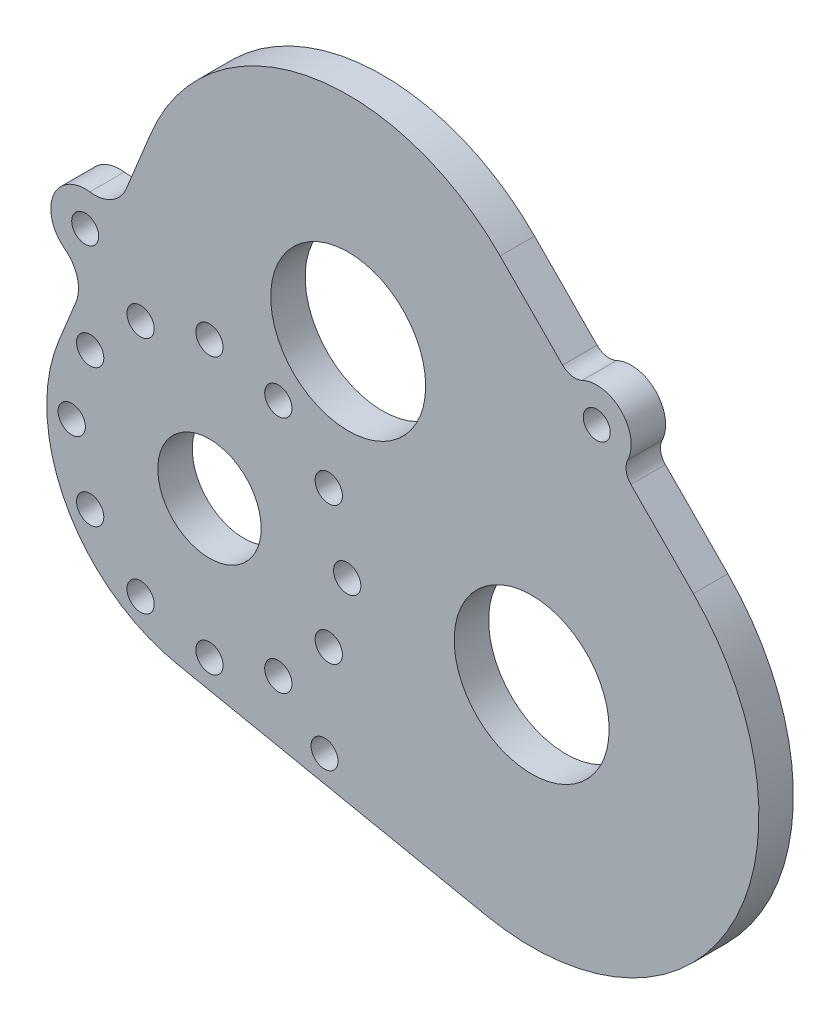
ISO-10303-21;
HEADER;
FILE_DESCRIPTION(('STEP AP214'),'2;1');
FILE_NAME('part.step','',(''),(''),'','','');
FILE_SCHEMA(('AUTOMOTIVE_DESIGN { 1 0 10303 214 1 1 1 1 }'));
ENDSEC;
DATA;
#1=APPLICATION_CONTEXT('core data for automotive mechanical design processes');
#2=APPLICATION_PROTOCOL_DEFINITION('international standard','automotive_design',2000,#1);
#3=PRODUCT_CONTEXT('',#1,'mechanical');
#4=PRODUCT('Part','Part','',(#3));
#5=PRODUCT_RELATED_PRODUCT_CATEGORY('part','',(#4));
#6=PRODUCT_DEFINITION_FORMATION('','',#4);
#7=PRODUCT_DEFINITION_CONTEXT('part definition',#1,'design');
#8=PRODUCT_DEFINITION('design','',#6,#7);
#9=PRODUCT_DEFINITION_SHAPE('','',#8);
#10=(LENGTH_UNIT() NAMED_UNIT(*) SI_UNIT(.MILLI.,.METRE.));
#11=(NAMED_UNIT(*) PLANE_ANGLE_UNIT() SI_UNIT($,.RADIAN.));
#12=(NAMED_UNIT(*) SI_UNIT($,.STERADIAN.) SOLID_ANGLE_UNIT());
#13=UNCERTAINTY_MEASURE_WITH_UNIT(LENGTH_MEASURE(1.E-05),#10,'distance_accuracy_value','');
#14=(GEOMETRIC_REPRESENTATION_CONTEXT(3) GLOBAL_UNCERTAINTY_ASSIGNED_CONTEXT((#13)) GLOBAL_UNIT_ASSIGNED_CONTEXT((#10,
#11,#12)) REPRESENTATION_CONTEXT('',''));
#15=CARTESIAN_POINT('',(0.,0.,0.));
#16=DIRECTION('',(0.,0.,1.));
#17=DIRECTION('',(1.,0.,0.));
#18=AXIS2_PLACEMENT_3D('',#15,#16,#17);
#19=CARTESIAN_POINT('',(-103.933485855139,112.712500000049,6.35));
#20=DIRECTION('',(0.,0.,1.));
#21=DIRECTION('',(1.,0.,0.));
#22=AXIS2_PLACEMENT_3D('',#19,#20,#21);
#23=PLANE('',#22);
#24=CARTESIAN_POINT('',(-116.633485855139,134.709545256174,6.35));
#25=DIRECTION('',(0.,0.,1.));
#26=DIRECTION('',(1.,0.,0.));
#27=AXIS2_PLACEMENT_3D('',#24,#25,#26);
#28=CIRCLE('',#27,2.51459999999995);
#29=CARTESIAN_POINT('',(-114.118885855139,134.709545256174,6.35));
#30=VERTEX_POINT('',#29);
#31=EDGE_CURVE('E377',#30,#30,#28,.T.);
#32=ORIENTED_EDGE('',*,*,#31,.F.);
#33=EDGE_LOOP('',(#32));
#34=FACE_BOUND('',#33,.T.);
#35=CARTESIAN_POINT('',(-91.2334858551395,134.709545256174,6.35));
#36=DIRECTION('',(0.,0.,1.));
#37=DIRECTION('',(1.,0.,0.));
#38=AXIS2_PLACEMENT_3D('',#35,#36,#37);
#39=CIRCLE('',#38,2.5146);
#40=CARTESIAN_POINT('',(-88.7188858551395,134.709545256174,6.35));
#41=VERTEX_POINT('',#40);
#42=EDGE_CURVE('E389',#41,#41,#39,.T.);
#43=ORIENTED_EDGE('',*,*,#42,.F.);
#44=EDGE_LOOP('',(#43));
#45=FACE_BOUND('',#44,.T.);
#46=CARTESIAN_POINT('',(-81.9364405990149,100.012500000049,6.35));
#47=DIRECTION('',(0.,0.,1.));
#48=DIRECTION('',(1.,0.,0.));
#49=AXIS2_PLACEMENT_3D('',#46,#47,#48);
#50=CIRCLE('',#49,2.51459999999999);
#51=CARTESIAN_POINT('',(-79.4218405990149,100.012500000049,6.35));
#52=VERTEX_POINT('',#51);
#53=EDGE_CURVE('E401',#52,#52,#50,.T.);
#54=ORIENTED_EDGE('',*,*,#53,.F.);
#55=EDGE_LOOP('',(#54));
#56=FACE_BOUND('',#55,.T.);
#57=CARTESIAN_POINT('',(-116.63348585514,90.7154547439244,6.35));
#58=DIRECTION('',(0.,0.,1.));
#59=DIRECTION('',(1.,0.,0.));
#60=AXIS2_PLACEMENT_3D('',#57,#58,#59);
#61=CIRCLE('',#60,2.51460000000001);
#62=CARTESIAN_POINT('',(-114.11888585514,90.7154547439244,6.35));
#63=VERTEX_POINT('',#62);
#64=EDGE_CURVE('E413',#63,#63,#61,.T.);
#65=ORIENTED_EDGE('',*,*,#64,.F.);
#66=EDGE_LOOP('',(#65));
#67=FACE_BOUND('',#66,.T.);
#68=CARTESIAN_POINT('',(-129.333485855139,112.712500000049,6.35));
#69=DIRECTION('',(0.,0.,1.));
#70=DIRECTION('',(1.,0.,0.));
#71=AXIS2_PLACEMENT_3D('',#68,#69,#70);
#72=CIRCLE('',#71,2.51460000000001);
#73=CARTESIAN_POINT('',(-126.818885855139,112.712500000049,6.35));
#74=VERTEX_POINT('',#73);
#75=EDGE_CURVE('E425',#74,#74,#72,.T.);
#76=ORIENTED_EDGE('',*,*,#75,.F.);
#77=EDGE_LOOP('',(#76));
#78=FACE_BOUND('',#77,.T.);
#79=CARTESIAN_POINT('',(-78.5334858551395,112.712500000049,6.35));
#80=DIRECTION('',(0.,0.,1.));
#81=DIRECTION('',(1.,0.,0.));
#82=AXIS2_PLACEMENT_3D('',#79,#80,#81);
#83=CIRCLE('',#82,2.51460000000001);
#84=CARTESIAN_POINT('',(-76.0188858551395,112.712500000049,6.35));
#85=VERTEX_POINT('',#84);
#86=EDGE_CURVE('E437',#85,#85,#83,.T.);
#87=ORIENTED_EDGE('',*,*,#86,.F.);
#88=EDGE_LOOP('',(#87));
#89=FACE_BOUND('',#88,.T.);
#90=CARTESIAN_POINT('',(-32.5089058218242,160.208997143062,6.35));
#91=DIRECTION('',(0.,0.,1.));
#92=DIRECTION('',(1.,0.,0.));
#93=AXIS2_PLACEMENT_3D('',#90,#91,#92);
#94=CIRCLE('',#93,2.48920000000002);
#95=CARTESIAN_POINT('',(-30.0197058218242,160.208997143062,6.35));
#96=VERTEX_POINT('',#95);
#97=EDGE_CURVE('E449',#96,#96,#94,.T.);
#98=ORIENTED_EDGE('',*,*,#97,.F.);
#99=EDGE_LOOP('',(#98));
#100=FACE_BOUND('',#99,.T.);
#101=CARTESIAN_POINT('',(-126.845846883905,144.36719939503,6.35));
#102=DIRECTION('',(0.,0.,1.));
#103=DIRECTION('',(1.,0.,0.));
#104=AXIS2_PLACEMENT_3D('',#101,#102,#103);
#105=CIRCLE('',#104,2.48920000000002);
#106=CARTESIAN_POINT('',(-124.356646883905,144.36719939503,6.35));
#107=VERTEX_POINT('',#106);
#108=EDGE_CURVE('E461',#107,#107,#105,.T.);
#109=ORIENTED_EDGE('',*,*,#108,.F.);
#110=EDGE_LOOP('',(#109));
#111=FACE_BOUND('',#110,.T.);
#112=CARTESIAN_POINT('',(-82.7124173793798,82.6107533273538,6.35));
#113=DIRECTION('',(0.,0.,1.));
#114=DIRECTION('',(1.,0.,0.));
#115=AXIS2_PLACEMENT_3D('',#112,#113,#114);
#116=CIRCLE('',#115,2.4892);
#117=CARTESIAN_POINT('',(-80.2232173793798,82.6107533273538,6.35));
#118=VERTEX_POINT('',#117);
#119=EDGE_CURVE('E174',#118,#118,#116,.T.);
#120=ORIENTED_EDGE('',*,*,#119,.F.);
#121=EDGE_LOOP('',(#120));
#122=FACE_BOUND('',#121,.T.);
#123=CARTESIAN_POINT('',(-103.933485855139,112.712500000049,6.35));
#124=DIRECTION('',(0.,0.,1.));
#125=DIRECTION('',(1.,0.,0.));
#126=AXIS2_PLACEMENT_3D('',#123,#124,#125);
#127=CIRCLE('',#126,30.);
#128=CARTESIAN_POINT('',(-131.709228824364,124.048641429458,6.35));
#129=VERTEX_POINT('',#128);
#130=CARTESIAN_POINT('',(-109.946477939306,83.32127807588,6.35));
#131=VERTEX_POINT('',#130);
#132=EDGE_CURVE('E197',#129,#131,#127,.T.);
#133=ORIENTED_EDGE('',*,*,#132,.T.);
#134=DIRECTION('',(0.979707397472299,-0.200433069472219,0.));
#135=VECTOR('',#134,1.);
#136=CARTESIAN_POINT('',(-109.946477939306,83.32127807588,6.35));
#137=LINE('',#136,#135);
#138=CARTESIAN_POINT('',(-52.9123036215385,71.6529629719849,6.35));
#139=VERTEX_POINT('',#138);
#140=EDGE_CURVE('E115',#131,#139,#137,.T.);
#141=ORIENTED_EDGE('',*,*,#140,.T.);
#142=CARTESIAN_POINT('',(-44.5121536799577,112.712500000049,6.35));
#143=DIRECTION('',(0.,0.,1.));
#144=DIRECTION('',(1.,0.,0.));
#145=AXIS2_PLACEMENT_3D('',#142,#143,#144);
#146=CIRCLE('',#145,41.9099999999999);
#147=CARTESIAN_POINT('',(-14.6868741767921,142.155679219658,6.35));
#148=VERTEX_POINT('',#147);
#149=EDGE_CURVE('E230',#139,#148,#146,.T.);
#150=ORIENTED_EDGE('',*,*,#149,.T.);
#151=DIRECTION('',(-0.702533505597935,0.711650668173842,0.));
#152=VECTOR('',#151,1.);
#153=CARTESIAN_POINT('',(-26.1999750079222,153.818191874131,6.35));
#154=LINE('',#153,#152);
#155=CARTESIAN_POINT('',(-26.1999750079222,153.818191874131,6.35));
#156=VERTEX_POINT('',#155);
#157=EDGE_CURVE('E249',#148,#156,#154,.T.);
#158=ORIENTED_EDGE('',*,*,#157,.T.);
#159=CARTESIAN_POINT('',(-23.9404841364703,156.048735754404,6.35));
#160=DIRECTION('',(0.,0.,-1.));
#161=DIRECTION('',(1.,0.,0.));
#162=AXIS2_PLACEMENT_3D('',#159,#160,#161);
#163=CIRCLE('',#162,3.17500000000002);
#164=CARTESIAN_POINT('',(-26.7966246982549,157.435489550623,6.35));
#165=VERTEX_POINT('',#164);
#166=EDGE_CURVE('E246',#156,#165,#163,.T.);
#167=ORIENTED_EDGE('',*,*,#166,.T.);
#168=CARTESIAN_POINT('',(-32.5089058218242,160.208997143062,6.35));
#169=DIRECTION('',(0.,0.,1.));
#170=DIRECTION('',(1.,0.,0.));
#171=AXIS2_PLACEMENT_3D('',#168,#169,#170);
#172=CIRCLE('',#171,6.35);
#173=CARTESIAN_POINT('',(-35.2085324501243,165.956563242531,6.35));
#174=VERTEX_POINT('',#173);
#175=EDGE_CURVE('E248',#165,#174,#172,.T.);
#176=ORIENTED_EDGE('',*,*,#175,.T.);
#177=CARTESIAN_POINT('',(-36.5583457642743,168.830346292266,6.35));
#178=DIRECTION('',(0.,0.,-1.));
#179=DIRECTION('',(1.,0.,0.));
#180=AXIS2_PLACEMENT_3D('',#177,#178,#179);
#181=CIRCLE('',#180,3.17500000000001);
#182=CARTESIAN_POINT('',(-38.8178366357263,166.599802411993,6.35));
#183=VERTEX_POINT('',#182);
#184=EDGE_CURVE('E251',#174,#183,#181,.T.);
#185=ORIENTED_EDGE('',*,*,#184,.T.);
#186=DIRECTION('',(-0.702533505597935,0.711650668173843,0.));
#187=VECTOR('',#186,1.);
#188=CARTESIAN_POINT('',(-50.3309374668564,178.262315066465,6.35));
#189=LINE('',#188,#187);
#190=CARTESIAN_POINT('',(-50.3309374668564,178.262315066465,6.35));
#191=VERTEX_POINT('',#190);
#192=EDGE_CURVE('E257',#183,#191,#189,.T.);
#193=ORIENTED_EDGE('',*,*,#192,.T.);
#194=CARTESIAN_POINT('',(-78.3486242728605,150.603570951074,6.35));
#195=DIRECTION('',(0.,0.,1.));
#196=DIRECTION('',(1.,0.,0.));
#197=AXIS2_PLACEMENT_3D('',#194,#195,#196);
#198=CIRCLE('',#197,39.37);
#199=CARTESIAN_POINT('',(-114.799657629473,165.480367220268,6.35));
#200=VERTEX_POINT('',#199);
#201=EDGE_CURVE('E259',#191,#200,#198,.T.);
#202=ORIENTED_EDGE('',*,*,#201,.T.);
#203=DIRECTION('',(-0.377871380980286,-0.925858098974163,0.));
#204=VECTOR('',#203,1.);
#205=CARTESIAN_POINT('',(-114.799657629473,165.480367220268,6.35));
#206=LINE('',#205,#204);
#207=CARTESIAN_POINT('',(-119.259668049057,154.552477529951,6.35));
#208=VERTEX_POINT('',#207);
#209=EDGE_CURVE('E261',#200,#208,#206,.T.);
#210=ORIENTED_EDGE('',*,*,#209,.T.);
#211=CARTESIAN_POINT('',(-125.138866977543,156.951960799176,6.35));
#212=DIRECTION('',(0.,0.,-1.));
#213=DIRECTION('',(1.,0.,0.));
#214=AXIS2_PLACEMENT_3D('',#211,#212,#213);
#215=CIRCLE('',#214,6.35);
#216=CARTESIAN_POINT('',(-125.992356930724,150.659580097103,6.35));
#217=VERTEX_POINT('',#216);
#218=EDGE_CURVE('E152',#208,#217,#215,.T.);
#219=ORIENTED_EDGE('',*,*,#218,.T.);
#220=CARTESIAN_POINT('',(-126.845846883905,144.36719939503,6.35));
#221=DIRECTION('',(0.,0.,1.));
#222=DIRECTION('',(1.,0.,0.));
#223=AXIS2_PLACEMENT_3D('',#220,#221,#222);
#224=CIRCLE('',#223,6.35000000000003);
#225=CARTESIAN_POINT('',(-130.638936301329,139.27456032757,6.35));
#226=VERTEX_POINT('',#225);
#227=EDGE_CURVE('E146',#217,#226,#224,.T.);
#228=ORIENTED_EDGE('',*,*,#227,.T.);
#229=CARTESIAN_POINT('',(-134.432025718754,134.181921260109,6.35));
#230=DIRECTION('',(0.,0.,-1.));
#231=DIRECTION('',(1.,0.,0.));
#232=AXIS2_PLACEMENT_3D('',#229,#230,#231);
#233=CIRCLE('',#232,6.34999999999996);
#234=CARTESIAN_POINT('',(-128.552826790268,131.782437990884,6.35));
#235=VERTEX_POINT('',#234);
#236=EDGE_CURVE('E150',#226,#235,#233,.T.);
#237=ORIENTED_EDGE('',*,*,#236,.T.);
#238=DIRECTION('',(-0.377871380980287,-0.925858098974163,0.));
#239=VECTOR('',#238,1.);
#240=CARTESIAN_POINT('',(-128.552826790268,131.782437990884,6.35));
#241=LINE('',#240,#239);
#242=EDGE_CURVE('E54',#235,#129,#241,.T.);
#243=ORIENTED_EDGE('',*,*,#242,.T.);
#244=EDGE_LOOP('',(#133,#141,#150,#158,#167,#176,#185,#193,#202,#210,#219,#228,#237,#243));
#245=FACE_BOUND('',#244,.T.);
#246=CARTESIAN_POINT('',(-44.5121536799578,112.712500000049,6.35));
#247=DIRECTION('',(0.,0.,1.));
#248=DIRECTION('',(1.,0.,0.));
#249=AXIS2_PLACEMENT_3D('',#246,#247,#248);
#250=CIRCLE('',#249,14.2875);
#251=CARTESIAN_POINT('',(-30.2246536799578,112.712500000049,6.35));
#252=VERTEX_POINT('',#251);
#253=EDGE_CURVE('E467',#252,#252,#250,.T.);
#254=ORIENTED_EDGE('',*,*,#253,.F.);
#255=EDGE_LOOP('',(#254));
#256=FACE_BOUND('',#255,.T.);
#257=CARTESIAN_POINT('',(-78.3486242728605,150.603570951074,6.35));
#258=DIRECTION('',(0.,0.,1.));
#259=DIRECTION('',(1.,0.,0.));
#260=AXIS2_PLACEMENT_3D('',#257,#258,#259);
#261=CIRCLE('',#260,14.2874999999999);
#262=CARTESIAN_POINT('',(-64.0611242728606,150.603570951074,6.35));
#263=VERTEX_POINT('',#262);
#264=EDGE_CURVE('E455',#263,#263,#261,.T.);
#265=ORIENTED_EDGE('',*,*,#264,.F.);
#266=EDGE_LOOP('',(#265));
#267=FACE_BOUND('',#266,.T.);
#268=CARTESIAN_POINT('',(-103.933485855139,112.712500000049,6.35));
#269=DIRECTION('',(0.,0.,1.));
#270=DIRECTION('',(1.,0.,0.));
#271=AXIS2_PLACEMENT_3D('',#268,#269,#270);
#272=CIRCLE('',#271,9.52500000000001);
#273=CARTESIAN_POINT('',(-94.4084858551395,112.712500000049,6.35));
#274=VERTEX_POINT('',#273);
#275=EDGE_CURVE('E443',#274,#274,#272,.T.);
#276=ORIENTED_EDGE('',*,*,#275,.F.);
#277=EDGE_LOOP('',(#276));
#278=FACE_BOUND('',#277,.T.);
#279=CARTESIAN_POINT('',(-103.933485855139,87.312500000049,6.35));
#280=DIRECTION('',(0.,0.,1.));
#281=DIRECTION('',(1.,0.,0.));
#282=AXIS2_PLACEMENT_3D('',#279,#280,#281);
#283=CIRCLE('',#282,2.51460000000001);
#284=CARTESIAN_POINT('',(-101.418885855139,87.312500000049,6.35));
#285=VERTEX_POINT('',#284);
#286=EDGE_CURVE('E431',#285,#285,#283,.T.);
#287=ORIENTED_EDGE('',*,*,#286,.F.);
#288=EDGE_LOOP('',(#287));
#289=FACE_BOUND('',#288,.T.);
#290=CARTESIAN_POINT('',(-125.930531111264,100.012500000049,6.35));
#291=DIRECTION('',(0.,0.,1.));
#292=DIRECTION('',(1.,0.,0.));
#293=AXIS2_PLACEMENT_3D('',#290,#291,#292);
#294=CIRCLE('',#293,2.51460000000018);
#295=CARTESIAN_POINT('',(-123.415931111264,100.012500000049,6.35));
#296=VERTEX_POINT('',#295);
#297=EDGE_CURVE('E419',#296,#296,#294,.T.);
#298=ORIENTED_EDGE('',*,*,#297,.F.);
#299=EDGE_LOOP('',(#298));
#300=FACE_BOUND('',#299,.T.);
#301=CARTESIAN_POINT('',(-91.2334858551397,90.7154547439241,6.35));
#302=DIRECTION('',(0.,0.,1.));
#303=DIRECTION('',(1.,0.,0.));
#304=AXIS2_PLACEMENT_3D('',#301,#302,#303);
#305=CIRCLE('',#304,2.51460000000001);
#306=CARTESIAN_POINT('',(-88.7188858551397,90.7154547439241,6.35));
#307=VERTEX_POINT('',#306);
#308=EDGE_CURVE('E407',#307,#307,#305,.T.);
#309=ORIENTED_EDGE('',*,*,#308,.F.);
#310=EDGE_LOOP('',(#309));
#311=FACE_BOUND('',#310,.T.);
#312=CARTESIAN_POINT('',(-81.9364405990147,125.412500000049,6.35));
#313=DIRECTION('',(0.,0.,1.));
#314=DIRECTION('',(1.,0.,0.));
#315=AXIS2_PLACEMENT_3D('',#312,#313,#314);
#316=CIRCLE('',#315,2.5146);
#317=CARTESIAN_POINT('',(-79.4218405990147,125.412500000049,6.35));
#318=VERTEX_POINT('',#317);
#319=EDGE_CURVE('E395',#318,#318,#316,.T.);
#320=ORIENTED_EDGE('',*,*,#319,.F.);
#321=EDGE_LOOP('',(#320));
#322=FACE_BOUND('',#321,.T.);
#323=CARTESIAN_POINT('',(-103.933485855139,138.112500000049,6.35));
#324=DIRECTION('',(0.,0.,1.));
#325=DIRECTION('',(1.,0.,0.));
#326=AXIS2_PLACEMENT_3D('',#323,#324,#325);
#327=CIRCLE('',#326,2.51460000000001);
#328=CARTESIAN_POINT('',(-101.418885855139,138.112500000049,6.35));
#329=VERTEX_POINT('',#328);
#330=EDGE_CURVE('E383',#329,#329,#327,.T.);
#331=ORIENTED_EDGE('',*,*,#330,.F.);
#332=EDGE_LOOP('',(#331));
#333=FACE_BOUND('',#332,.T.);
#334=CARTESIAN_POINT('',(-125.930531111264,125.412500000049,6.35));
#335=DIRECTION('',(0.,0.,1.));
#336=DIRECTION('',(1.,0.,0.));
#337=AXIS2_PLACEMENT_3D('',#334,#335,#336);
#338=CIRCLE('',#337,2.51459999999991);
#339=CARTESIAN_POINT('',(-123.415931111264,125.412500000049,6.35));
#340=VERTEX_POINT('',#339);
#341=EDGE_CURVE('E368',#340,#340,#338,.T.);
#342=ORIENTED_EDGE('',*,*,#341,.F.);
#343=EDGE_LOOP('',(#342));
#344=FACE_BOUND('',#343,.T.);
#345=ADVANCED_FACE('F37',(#34,#45,#56,#67,#78,#89,#100,#111,#122,#245,#256,#267,#278,#289,#300,
#311,#322,#333,#344),#23,.T.);
#346=CARTESIAN_POINT('',(-103.933485855139,112.712500000049,0.));
#347=DIRECTION('',(0.,0.,1.));
#348=DIRECTION('',(1.,0.,0.));
#349=AXIS2_PLACEMENT_3D('',#346,#347,#348);
#350=PLANE('',#349);
#351=CARTESIAN_POINT('',(-103.933485855139,112.712500000049,0.));
#352=DIRECTION('',(0.,0.,1.));
#353=DIRECTION('',(1.,0.,0.));
#354=AXIS2_PLACEMENT_3D('',#351,#352,#353);
#355=CIRCLE('',#354,30.);
#356=CARTESIAN_POINT('',(-131.709228824364,124.048641429458,0.));
#357=VERTEX_POINT('',#356);
#358=CARTESIAN_POINT('',(-109.946477939306,83.32127807588,0.));
#359=VERTEX_POINT('',#358);
#360=EDGE_CURVE('E170',#357,#359,#355,.T.);
#361=ORIENTED_EDGE('',*,*,#360,.F.);
#362=DIRECTION('',(-0.377871380980287,-0.925858098974163,0.));
#363=VECTOR('',#362,1.);
#364=CARTESIAN_POINT('',(-128.552826790268,131.782437990884,0.));
#365=LINE('',#364,#363);
#366=CARTESIAN_POINT('',(-128.552826790268,131.782437990884,0.));
#367=VERTEX_POINT('',#366);
#368=EDGE_CURVE('E107',#367,#357,#365,.T.);
#369=ORIENTED_EDGE('',*,*,#368,.F.);
#370=CARTESIAN_POINT('',(-134.432025718754,134.181921260109,0.));
#371=DIRECTION('',(0.,0.,-1.));
#372=DIRECTION('',(1.,0.,0.));
#373=AXIS2_PLACEMENT_3D('',#370,#371,#372);
#374=CIRCLE('',#373,6.34999999999996);
#375=CARTESIAN_POINT('',(-130.638936301329,139.27456032757,0.));
#376=VERTEX_POINT('',#375);
#377=EDGE_CURVE('E101',#376,#367,#374,.T.);
#378=ORIENTED_EDGE('',*,*,#377,.F.);
#379=CARTESIAN_POINT('',(-126.845846883905,144.36719939503,0.));
#380=DIRECTION('',(0.,0.,1.));
#381=DIRECTION('',(1.,0.,0.));
#382=AXIS2_PLACEMENT_3D('',#379,#380,#381);
#383=CIRCLE('',#382,6.35000000000003);
#384=CARTESIAN_POINT('',(-125.992356930724,150.659580097103,0.));
#385=VERTEX_POINT('',#384);
#386=EDGE_CURVE('E160',#385,#376,#383,.T.);
#387=ORIENTED_EDGE('',*,*,#386,.F.);
#388=CARTESIAN_POINT('',(-125.138866977543,156.951960799176,0.));
#389=DIRECTION('',(0.,0.,-1.));
#390=DIRECTION('',(1.,0.,0.));
#391=AXIS2_PLACEMENT_3D('',#388,#389,#390);
#392=CIRCLE('',#391,6.35);
#393=CARTESIAN_POINT('',(-119.259668049057,154.552477529951,0.));
#394=VERTEX_POINT('',#393);
#395=EDGE_CURVE('E192',#394,#385,#392,.T.);
#396=ORIENTED_EDGE('',*,*,#395,.F.);
#397=DIRECTION('',(-0.377871380980286,-0.925858098974163,0.));
#398=VECTOR('',#397,1.);
#399=CARTESIAN_POINT('',(-114.799657629473,165.480367220268,0.));
#400=LINE('',#399,#398);
#401=CARTESIAN_POINT('',(-114.799657629473,165.480367220268,0.));
#402=VERTEX_POINT('',#401);
#403=EDGE_CURVE('E190',#402,#394,#400,.T.);
#404=ORIENTED_EDGE('',*,*,#403,.F.);
#405=CARTESIAN_POINT('',(-78.3486242728605,150.603570951074,0.));
#406=DIRECTION('',(0.,0.,1.));
#407=DIRECTION('',(1.,0.,0.));
#408=AXIS2_PLACEMENT_3D('',#405,#406,#407);
#409=CIRCLE('',#408,39.37);
#410=CARTESIAN_POINT('',(-50.3309374668564,178.262315066465,0.));
#411=VERTEX_POINT('',#410);
#412=EDGE_CURVE('E188',#411,#402,#409,.T.);
#413=ORIENTED_EDGE('',*,*,#412,.F.);
#414=DIRECTION('',(-0.702533505597935,0.711650668173843,0.));
#415=VECTOR('',#414,1.);
#416=CARTESIAN_POINT('',(-50.3309374668564,178.262315066465,0.));
#417=LINE('',#416,#415);
#418=CARTESIAN_POINT('',(-38.8178366357263,166.599802411993,0.));
#419=VERTEX_POINT('',#418);
#420=EDGE_CURVE('E186',#419,#411,#417,.T.);
#421=ORIENTED_EDGE('',*,*,#420,.F.);
#422=CARTESIAN_POINT('',(-36.5583457642743,168.830346292266,0.));
#423=DIRECTION('',(0.,0.,-1.));
#424=DIRECTION('',(1.,0.,0.));
#425=AXIS2_PLACEMENT_3D('',#422,#423,#424);
#426=CIRCLE('',#425,3.17500000000001);
#427=CARTESIAN_POINT('',(-35.2085324501243,165.956563242531,0.));
#428=VERTEX_POINT('',#427);
#429=EDGE_CURVE('E184',#428,#419,#426,.T.);
#430=ORIENTED_EDGE('',*,*,#429,.F.);
#431=CARTESIAN_POINT('',(-32.5089058218242,160.208997143062,0.));
#432=DIRECTION('',(0.,0.,1.));
#433=DIRECTION('',(1.,0.,0.));
#434=AXIS2_PLACEMENT_3D('',#431,#432,#433);
#435=CIRCLE('',#434,6.35);
#436=CARTESIAN_POINT('',(-26.7966246982549,157.435489550623,0.));
#437=VERTEX_POINT('',#436);
#438=EDGE_CURVE('E182',#437,#428,#435,.T.);
#439=ORIENTED_EDGE('',*,*,#438,.F.);
#440=CARTESIAN_POINT('',(-23.9404841364703,156.048735754404,0.));
#441=DIRECTION('',(0.,0.,-1.));
#442=DIRECTION('',(1.,0.,0.));
#443=AXIS2_PLACEMENT_3D('',#440,#441,#442);
#444=CIRCLE('',#443,3.17500000000002);
#445=CARTESIAN_POINT('',(-26.1999750079222,153.818191874131,0.));
#446=VERTEX_POINT('',#445);
#447=EDGE_CURVE('E180',#446,#437,#444,.T.);
#448=ORIENTED_EDGE('',*,*,#447,.F.);
#449=DIRECTION('',(-0.702533505597935,0.711650668173842,0.));
#450=VECTOR('',#449,1.);
#451=CARTESIAN_POINT('',(-26.1999750079222,153.818191874131,0.));
#452=LINE('',#451,#450);
#453=CARTESIAN_POINT('',(-14.6868741767921,142.155679219658,0.));
#454=VERTEX_POINT('',#453);
#455=EDGE_CURVE('E178',#454,#446,#452,.T.);
#456=ORIENTED_EDGE('',*,*,#455,.F.);
#457=CARTESIAN_POINT('',(-44.5121536799577,112.712500000049,0.));
#458=DIRECTION('',(0.,0.,1.));
#459=DIRECTION('',(1.,0.,0.));
#460=AXIS2_PLACEMENT_3D('',#457,#458,#459);
#461=CIRCLE('',#460,41.9099999999999);
#462=CARTESIAN_POINT('',(-52.9123036215385,71.6529629719849,0.));
#463=VERTEX_POINT('',#462);
#464=EDGE_CURVE('E176',#463,#454,#461,.T.);
#465=ORIENTED_EDGE('',*,*,#464,.F.);
#466=DIRECTION('',(0.979707397472299,-0.200433069472219,0.));
#467=VECTOR('',#466,1.);
#468=CARTESIAN_POINT('',(-109.946477939306,83.32127807588,0.));
#469=LINE('',#468,#467);
#470=EDGE_CURVE('E173',#359,#463,#469,.T.);
#471=ORIENTED_EDGE('',*,*,#470,.F.);
#472=EDGE_LOOP('',(#361,#369,#378,#387,#396,#404,#413,#421,#430,#439,#448,#456,#465,#471));
#473=FACE_BOUND('',#472,.T.);
#474=CARTESIAN_POINT('',(-82.7124173793798,82.6107533273538,0.));
#475=DIRECTION('',(0.,0.,1.));
#476=DIRECTION('',(1.,0.,0.));
#477=AXIS2_PLACEMENT_3D('',#474,#475,#476);
#478=CIRCLE('',#477,2.4892);
#479=CARTESIAN_POINT('',(-80.2232173793798,82.6107533273538,0.));
#480=VERTEX_POINT('',#479);
#481=EDGE_CURVE('E470',#480,#480,#478,.T.);
#482=ORIENTED_EDGE('',*,*,#481,.T.);
#483=EDGE_LOOP('',(#482));
#484=FACE_BOUND('',#483,.T.);
#485=CARTESIAN_POINT('',(-44.5121536799578,112.712500000049,0.));
#486=DIRECTION('',(0.,0.,1.));
#487=DIRECTION('',(1.,0.,0.));
#488=AXIS2_PLACEMENT_3D('',#485,#486,#487);
#489=CIRCLE('',#488,14.2875);
#490=CARTESIAN_POINT('',(-30.2246536799578,112.712500000049,0.));
#491=VERTEX_POINT('',#490);
#492=EDGE_CURVE('E464',#491,#491,#489,.T.);
#493=ORIENTED_EDGE('',*,*,#492,.T.);
#494=EDGE_LOOP('',(#493));
#495=FACE_BOUND('',#494,.T.);
#496=CARTESIAN_POINT('',(-126.845846883905,144.36719939503,0.));
#497=DIRECTION('',(0.,0.,1.));
#498=DIRECTION('',(1.,0.,0.));
#499=AXIS2_PLACEMENT_3D('',#496,#497,#498);
#500=CIRCLE('',#499,2.48920000000002);
#501=CARTESIAN_POINT('',(-124.356646883905,144.36719939503,0.));
#502=VERTEX_POINT('',#501);
#503=EDGE_CURVE('E458',#502,#502,#500,.T.);
#504=ORIENTED_EDGE('',*,*,#503,.T.);
#505=EDGE_LOOP('',(#504));
#506=FACE_BOUND('',#505,.T.);
#507=CARTESIAN_POINT('',(-78.3486242728605,150.603570951074,0.));
#508=DIRECTION('',(0.,0.,1.));
#509=DIRECTION('',(1.,0.,0.));
#510=AXIS2_PLACEMENT_3D('',#507,#508,#509);
#511=CIRCLE('',#510,14.2874999999999);
#512=CARTESIAN_POINT('',(-64.0611242728606,150.603570951074,0.));
#513=VERTEX_POINT('',#512);
#514=EDGE_CURVE('E452',#513,#513,#511,.T.);
#515=ORIENTED_EDGE('',*,*,#514,.T.);
#516=EDGE_LOOP('',(#515));
#517=FACE_BOUND('',#516,.T.);
#518=CARTESIAN_POINT('',(-32.5089058218242,160.208997143062,0.));
#519=DIRECTION('',(0.,0.,1.));
#520=DIRECTION('',(1.,0.,0.));
#521=AXIS2_PLACEMENT_3D('',#518,#519,#520);
#522=CIRCLE('',#521,2.48920000000002);
#523=CARTESIAN_POINT('',(-30.0197058218242,160.208997143062,0.));
#524=VERTEX_POINT('',#523);
#525=EDGE_CURVE('E446',#524,#524,#522,.T.);
#526=ORIENTED_EDGE('',*,*,#525,.T.);
#527=EDGE_LOOP('',(#526));
#528=FACE_BOUND('',#527,.T.);
#529=CARTESIAN_POINT('',(-103.933485855139,112.712500000049,0.));
#530=DIRECTION('',(0.,0.,1.));
#531=DIRECTION('',(1.,0.,0.));
#532=AXIS2_PLACEMENT_3D('',#529,#530,#531);
#533=CIRCLE('',#532,9.52500000000001);
#534=CARTESIAN_POINT('',(-94.4084858551395,112.712500000049,0.));
#535=VERTEX_POINT('',#534);
#536=EDGE_CURVE('E440',#535,#535,#533,.T.);
#537=ORIENTED_EDGE('',*,*,#536,.T.);
#538=EDGE_LOOP('',(#537));
#539=FACE_BOUND('',#538,.T.);
#540=CARTESIAN_POINT('',(-78.5334858551395,112.712500000049,0.));
#541=DIRECTION('',(0.,0.,1.));
#542=DIRECTION('',(1.,0.,0.));
#543=AXIS2_PLACEMENT_3D('',#540,#541,#542);
#544=CIRCLE('',#543,2.51460000000001);
#545=CARTESIAN_POINT('',(-76.0188858551395,112.712500000049,0.));
#546=VERTEX_POINT('',#545);
#547=EDGE_CURVE('E434',#546,#546,#544,.T.);
#548=ORIENTED_EDGE('',*,*,#547,.T.);
#549=EDGE_LOOP('',(#548));
#550=FACE_BOUND('',#549,.T.);
#551=CARTESIAN_POINT('',(-103.933485855139,87.312500000049,0.));
#552=DIRECTION('',(0.,0.,1.));
#553=DIRECTION('',(1.,0.,0.));
#554=AXIS2_PLACEMENT_3D('',#551,#552,#553);
#555=CIRCLE('',#554,2.51460000000001);
#556=CARTESIAN_POINT('',(-101.418885855139,87.312500000049,0.));
#557=VERTEX_POINT('',#556);
#558=EDGE_CURVE('E428',#557,#557,#555,.T.);
#559=ORIENTED_EDGE('',*,*,#558,.T.);
#560=EDGE_LOOP('',(#559));
#561=FACE_BOUND('',#560,.T.);
#562=CARTESIAN_POINT('',(-129.333485855139,112.712500000049,0.));
#563=DIRECTION('',(0.,0.,1.));
#564=DIRECTION('',(1.,0.,0.));
#565=AXIS2_PLACEMENT_3D('',#562,#563,#564);
#566=CIRCLE('',#565,2.51460000000001);
#567=CARTESIAN_POINT('',(-126.818885855139,112.712500000049,0.));
#568=VERTEX_POINT('',#567);
#569=EDGE_CURVE('E422',#568,#568,#566,.T.);
#570=ORIENTED_EDGE('',*,*,#569,.T.);
#571=EDGE_LOOP('',(#570));
#572=FACE_BOUND('',#571,.T.);
#573=CARTESIAN_POINT('',(-125.930531111264,100.012500000049,0.));
#574=DIRECTION('',(0.,0.,1.));
#575=DIRECTION('',(1.,0.,0.));
#576=AXIS2_PLACEMENT_3D('',#573,#574,#575);
#577=CIRCLE('',#576,2.51460000000018);
#578=CARTESIAN_POINT('',(-123.415931111264,100.012500000049,0.));
#579=VERTEX_POINT('',#578);
#580=EDGE_CURVE('E416',#579,#579,#577,.T.);
#581=ORIENTED_EDGE('',*,*,#580,.T.);
#582=EDGE_LOOP('',(#581));
#583=FACE_BOUND('',#582,.T.);
#584=CARTESIAN_POINT('',(-116.63348585514,90.7154547439244,0.));
#585=DIRECTION('',(0.,0.,1.));
#586=DIRECTION('',(1.,0.,0.));
#587=AXIS2_PLACEMENT_3D('',#584,#585,#586);
#588=CIRCLE('',#587,2.51460000000001);
#589=CARTESIAN_POINT('',(-114.11888585514,90.7154547439244,0.));
#590=VERTEX_POINT('',#589);
#591=EDGE_CURVE('E410',#590,#590,#588,.T.);
#592=ORIENTED_EDGE('',*,*,#591,.T.);
#593=EDGE_LOOP('',(#592));
#594=FACE_BOUND('',#593,.T.);
#595=CARTESIAN_POINT('',(-91.2334858551397,90.7154547439241,0.));
#596=DIRECTION('',(0.,0.,1.));
#597=DIRECTION('',(1.,0.,0.));
#598=AXIS2_PLACEMENT_3D('',#595,#596,#597);
#599=CIRCLE('',#598,2.51460000000001);
#600=CARTESIAN_POINT('',(-88.7188858551397,90.7154547439241,0.));
#601=VERTEX_POINT('',#600);
#602=EDGE_CURVE('E404',#601,#601,#599,.T.);
#603=ORIENTED_EDGE('',*,*,#602,.T.);
#604=EDGE_LOOP('',(#603));
#605=FACE_BOUND('',#604,.T.);
#606=CARTESIAN_POINT('',(-81.9364405990149,100.012500000049,0.));
#607=DIRECTION('',(0.,0.,1.));
#608=DIRECTION('',(1.,0.,0.));
#609=AXIS2_PLACEMENT_3D('',#606,#607,#608);
#610=CIRCLE('',#609,2.51459999999999);
#611=CARTESIAN_POINT('',(-79.4218405990149,100.012500000049,0.));
#612=VERTEX_POINT('',#611);
#613=EDGE_CURVE('E398',#612,#612,#610,.T.);
#614=ORIENTED_EDGE('',*,*,#613,.T.);
#615=EDGE_LOOP('',(#614));
#616=FACE_BOUND('',#615,.T.);
#617=CARTESIAN_POINT('',(-81.9364405990147,125.412500000049,0.));
#618=DIRECTION('',(0.,0.,1.));
#619=DIRECTION('',(1.,0.,0.));
#620=AXIS2_PLACEMENT_3D('',#617,#618,#619);
#621=CIRCLE('',#620,2.5146);
#622=CARTESIAN_POINT('',(-79.4218405990147,125.412500000049,0.));
#623=VERTEX_POINT('',#622);
#624=EDGE_CURVE('E392',#623,#623,#621,.T.);
#625=ORIENTED_EDGE('',*,*,#624,.T.);
#626=EDGE_LOOP('',(#625));
#627=FACE_BOUND('',#626,.T.);
#628=CARTESIAN_POINT('',(-91.2334858551395,134.709545256174,0.));
#629=DIRECTION('',(0.,0.,1.));
#630=DIRECTION('',(1.,0.,0.));
#631=AXIS2_PLACEMENT_3D('',#628,#629,#630);
#632=CIRCLE('',#631,2.5146);
#633=CARTESIAN_POINT('',(-88.7188858551395,134.709545256174,0.));
#634=VERTEX_POINT('',#633);
#635=EDGE_CURVE('E386',#634,#634,#632,.T.);
#636=ORIENTED_EDGE('',*,*,#635,.T.);
#637=EDGE_LOOP('',(#636));
#638=FACE_BOUND('',#637,.T.);
#639=CARTESIAN_POINT('',(-103.933485855139,138.112500000049,0.));
#640=DIRECTION('',(0.,0.,1.));
#641=DIRECTION('',(1.,0.,0.));
#642=AXIS2_PLACEMENT_3D('',#639,#640,#641);
#643=CIRCLE('',#642,2.51460000000001);
#644=CARTESIAN_POINT('',(-101.418885855139,138.112500000049,0.));
#645=VERTEX_POINT('',#644);
#646=EDGE_CURVE('E380',#645,#645,#643,.T.);
#647=ORIENTED_EDGE('',*,*,#646,.T.);
#648=EDGE_LOOP('',(#647));
#649=FACE_BOUND('',#648,.T.);
#650=CARTESIAN_POINT('',(-116.633485855139,134.709545256174,0.));
#651=DIRECTION('',(0.,0.,1.));
#652=DIRECTION('',(1.,0.,0.));
#653=AXIS2_PLACEMENT_3D('',#650,#651,#652);
#654=CIRCLE('',#653,2.51459999999995);
#655=CARTESIAN_POINT('',(-114.118885855139,134.709545256174,0.));
#656=VERTEX_POINT('',#655);
#657=EDGE_CURVE('E374',#656,#656,#654,.T.);
#658=ORIENTED_EDGE('',*,*,#657,.T.);
#659=EDGE_LOOP('',(#658));
#660=FACE_BOUND('',#659,.T.);
#661=CARTESIAN_POINT('',(-125.930531111264,125.412500000049,0.));
#662=DIRECTION('',(0.,0.,1.));
#663=DIRECTION('',(1.,0.,0.));
#664=AXIS2_PLACEMENT_3D('',#661,#662,#663);
#665=CIRCLE('',#664,2.51459999999991);
#666=CARTESIAN_POINT('',(-123.415931111264,125.412500000049,0.));
#667=VERTEX_POINT('',#666);
#668=EDGE_CURVE('E371',#667,#667,#665,.T.);
#669=ORIENTED_EDGE('',*,*,#668,.T.);
#670=EDGE_LOOP('',(#669));
#671=FACE_BOUND('',#670,.T.);
#672=ADVANCED_FACE('F234',(#473,#484,#495,#506,#517,#528,#539,#550,#561,#572,#583,#594,#605,
#616,#627,#638,#649,#660,#671),#350,.F.);
#673=CARTESIAN_POINT('',(-103.933485855139,112.712500000049,6.35));
#674=DIRECTION('',(0.,0.,-1.));
#675=DIRECTION('',(-1.,0.,0.));
#676=AXIS2_PLACEMENT_3D('',#673,#674,#675);
#677=CYLINDRICAL_SURFACE('',#676,30.);
#678=ORIENTED_EDGE('',*,*,#360,.T.);
#679=DIRECTION('',(0.,0.,-1.));
#680=VECTOR('',#679,1.);
#681=CARTESIAN_POINT('',(-109.946477939306,83.32127807588,6.35));
#682=LINE('',#681,#680);
#683=EDGE_CURVE('E11',#131,#359,#682,.T.);
#684=ORIENTED_EDGE('',*,*,#683,.F.);
#685=ORIENTED_EDGE('',*,*,#132,.F.);
#686=DIRECTION('',(0.,0.,-1.));
#687=VECTOR('',#686,1.);
#688=CARTESIAN_POINT('',(-131.709228824364,124.048641429458,6.35));
#689=LINE('',#688,#687);
#690=EDGE_CURVE('E166',#129,#357,#689,.T.);
#691=ORIENTED_EDGE('',*,*,#690,.T.);
#692=EDGE_LOOP('',(#678,#684,#685,#691));
#693=FACE_BOUND('',#692,.T.);
#694=ADVANCED_FACE('F39',(#693),#677,.T.);
#695=CARTESIAN_POINT('',(-109.946477939306,83.32127807588,6.35));
#696=DIRECTION('',(0.200433069472219,0.979707397472299,0.));
#697=DIRECTION('',(-0.979707397472299,0.200433069472219,0.));
#698=AXIS2_PLACEMENT_3D('',#695,#696,#697);
#699=PLANE('',#698);
#700=ORIENTED_EDGE('',*,*,#470,.T.);
#701=DIRECTION('',(0.,0.,-1.));
#702=VECTOR('',#701,1.);
#703=CARTESIAN_POINT('',(-52.9123036215385,71.6529629719849,6.35));
#704=LINE('',#703,#702);
#705=EDGE_CURVE('E46',#139,#463,#704,.T.);
#706=ORIENTED_EDGE('',*,*,#705,.F.);
#707=ORIENTED_EDGE('',*,*,#140,.F.);
#708=ORIENTED_EDGE('',*,*,#683,.T.);
#709=EDGE_LOOP('',(#700,#706,#707,#708));
#710=FACE_BOUND('',#709,.T.);
#711=ADVANCED_FACE('F738',(#710),#699,.F.);
#712=CARTESIAN_POINT('',(-44.5121536799577,112.712500000049,6.35));
#713=DIRECTION('',(0.,0.,-1.));
#714=DIRECTION('',(-1.,0.,0.));
#715=AXIS2_PLACEMENT_3D('',#712,#713,#714);
#716=CYLINDRICAL_SURFACE('',#715,41.9099999999999);
#717=ORIENTED_EDGE('',*,*,#464,.T.);
#718=DIRECTION('',(0.,0.,-1.));
#719=VECTOR('',#718,1.);
#720=CARTESIAN_POINT('',(-14.6868741767921,142.155679219658,6.35));
#721=LINE('',#720,#719);
#722=EDGE_CURVE('E222',#148,#454,#721,.T.);
#723=ORIENTED_EDGE('',*,*,#722,.F.);
#724=ORIENTED_EDGE('',*,*,#149,.F.);
#725=ORIENTED_EDGE('',*,*,#705,.T.);
#726=EDGE_LOOP('',(#717,#723,#724,#725));
#727=FACE_BOUND('',#726,.T.);
#728=ADVANCED_FACE('F228',(#727),#716,.T.);
#729=CARTESIAN_POINT('',(-26.1999750079222,153.818191874131,6.35));
#730=DIRECTION('',(-0.711650668173842,-0.702533505597935,0.));
#731=DIRECTION('',(0.702533505597935,-0.711650668173842,0.));
#732=AXIS2_PLACEMENT_3D('',#729,#730,#731);
#733=PLANE('',#732);
#734=ORIENTED_EDGE('',*,*,#455,.T.);
#735=DIRECTION('',(0.,0.,-1.));
#736=VECTOR('',#735,1.);
#737=CARTESIAN_POINT('',(-26.1999750079222,153.818191874131,6.35));
#738=LINE('',#737,#736);
#739=EDGE_CURVE('E219',#156,#446,#738,.T.);
#740=ORIENTED_EDGE('',*,*,#739,.F.);
#741=ORIENTED_EDGE('',*,*,#157,.F.);
#742=ORIENTED_EDGE('',*,*,#722,.T.);
#743=EDGE_LOOP('',(#734,#740,#741,#742));
#744=FACE_BOUND('',#743,.T.);
#745=ADVANCED_FACE('F240',(#744),#733,.F.);
#746=CARTESIAN_POINT('',(-23.9404841364703,156.048735754404,6.35));
#747=DIRECTION('',(0.,0.,-1.));
#748=DIRECTION('',(-1.,0.,0.));
#749=AXIS2_PLACEMENT_3D('',#746,#747,#748);
#750=CYLINDRICAL_SURFACE('',#749,3.17500000000002);
#751=ORIENTED_EDGE('',*,*,#447,.T.);
#752=DIRECTION('',(0.,0.,-1.));
#753=VECTOR('',#752,1.);
#754=CARTESIAN_POINT('',(-26.7966246982549,157.435489550623,6.35));
#755=LINE('',#754,#753);
#756=EDGE_CURVE('E216',#165,#437,#755,.T.);
#757=ORIENTED_EDGE('',*,*,#756,.F.);
#758=ORIENTED_EDGE('',*,*,#166,.F.);
#759=ORIENTED_EDGE('',*,*,#739,.T.);
#760=EDGE_LOOP('',(#751,#757,#758,#759));
#761=FACE_BOUND('',#760,.T.);
#762=ADVANCED_FACE('F244',(#761),#750,.F.);
#763=CARTESIAN_POINT('',(-32.5089058218242,160.208997143062,6.35));
#764=DIRECTION('',(0.,0.,-1.));
#765=DIRECTION('',(-1.,0.,0.));
#766=AXIS2_PLACEMENT_3D('',#763,#764,#765);
#767=CYLINDRICAL_SURFACE('',#766,6.35);
#768=ORIENTED_EDGE('',*,*,#438,.T.);
#769=DIRECTION('',(0.,0.,-1.));
#770=VECTOR('',#769,1.);
#771=CARTESIAN_POINT('',(-35.2085324501243,165.956563242531,6.35));
#772=LINE('',#771,#770);
#773=EDGE_CURVE('E213',#174,#428,#772,.T.);
#774=ORIENTED_EDGE('',*,*,#773,.F.);
#775=ORIENTED_EDGE('',*,*,#175,.F.);
#776=ORIENTED_EDGE('',*,*,#756,.T.);
#777=EDGE_LOOP('',(#768,#774,#775,#776));
#778=FACE_BOUND('',#777,.T.);
#779=ADVANCED_FACE('F699',(#778),#767,.T.);
#780=CARTESIAN_POINT('',(-36.5583457642743,168.830346292266,6.35));
#781=DIRECTION('',(0.,0.,-1.));
#782=DIRECTION('',(-1.,0.,0.));
#783=AXIS2_PLACEMENT_3D('',#780,#781,#782);
#784=CYLINDRICAL_SURFACE('',#783,3.17500000000001);
#785=ORIENTED_EDGE('',*,*,#429,.T.);
#786=DIRECTION('',(0.,0.,-1.));
#787=VECTOR('',#786,1.);
#788=CARTESIAN_POINT('',(-38.8178366357263,166.599802411993,6.35));
#789=LINE('',#788,#787);
#790=EDGE_CURVE('E210',#183,#419,#789,.T.);
#791=ORIENTED_EDGE('',*,*,#790,.F.);
#792=ORIENTED_EDGE('',*,*,#184,.F.);
#793=ORIENTED_EDGE('',*,*,#773,.T.);
#794=EDGE_LOOP('',(#785,#791,#792,#793));
#795=FACE_BOUND('',#794,.T.);
#796=ADVANCED_FACE('F688',(#795),#784,.F.);
#797=CARTESIAN_POINT('',(-50.3309374668564,178.262315066465,6.35));
#798=DIRECTION('',(-0.711650668173843,-0.702533505597934,0.));
#799=DIRECTION('',(0.702533505597934,-0.711650668173843,0.));
#800=AXIS2_PLACEMENT_3D('',#797,#798,#799);
#801=PLANE('',#800);
#802=ORIENTED_EDGE('',*,*,#420,.T.);
#803=DIRECTION('',(0.,0.,-1.));
#804=VECTOR('',#803,1.);
#805=CARTESIAN_POINT('',(-50.3309374668564,178.262315066465,6.35));
#806=LINE('',#805,#804);
#807=EDGE_CURVE('E207',#191,#411,#806,.T.);
#808=ORIENTED_EDGE('',*,*,#807,.F.);
#809=ORIENTED_EDGE('',*,*,#192,.F.);
#810=ORIENTED_EDGE('',*,*,#790,.T.);
#811=EDGE_LOOP('',(#802,#808,#809,#810));
#812=FACE_BOUND('',#811,.T.);
#813=ADVANCED_FACE('F677',(#812),#801,.F.);
#814=CARTESIAN_POINT('',(-78.3486242728605,150.603570951074,6.35));
#815=DIRECTION('',(0.,0.,-1.));
#816=DIRECTION('',(-1.,0.,0.));
#817=AXIS2_PLACEMENT_3D('',#814,#815,#816);
#818=CYLINDRICAL_SURFACE('',#817,39.37);
#819=ORIENTED_EDGE('',*,*,#412,.T.);
#820=DIRECTION('',(0.,0.,-1.));
#821=VECTOR('',#820,1.);
#822=CARTESIAN_POINT('',(-114.799657629473,165.480367220268,6.35));
#823=LINE('',#822,#821);
#824=EDGE_CURVE('E204',#200,#402,#823,.T.);
#825=ORIENTED_EDGE('',*,*,#824,.F.);
#826=ORIENTED_EDGE('',*,*,#201,.F.);
#827=ORIENTED_EDGE('',*,*,#807,.T.);
#828=EDGE_LOOP('',(#819,#825,#826,#827));
#829=FACE_BOUND('',#828,.T.);
#830=ADVANCED_FACE('F667',(#829),#818,.T.);
#831=CARTESIAN_POINT('',(-114.799657629473,165.480367220268,6.35));
#832=DIRECTION('',(0.925858098974163,-0.377871380980286,0.));
#833=DIRECTION('',(0.377871380980286,0.925858098974163,0.));
#834=AXIS2_PLACEMENT_3D('',#831,#832,#833);
#835=PLANE('',#834);
#836=ORIENTED_EDGE('',*,*,#403,.T.);
#837=DIRECTION('',(0.,0.,-1.));
#838=VECTOR('',#837,1.);
#839=CARTESIAN_POINT('',(-119.259668049057,154.552477529951,6.35));
#840=LINE('',#839,#838);
#841=EDGE_CURVE('E201',#208,#394,#840,.T.);
#842=ORIENTED_EDGE('',*,*,#841,.F.);
#843=ORIENTED_EDGE('',*,*,#209,.F.);
#844=ORIENTED_EDGE('',*,*,#824,.T.);
#845=EDGE_LOOP('',(#836,#842,#843,#844));
#846=FACE_BOUND('',#845,.T.);
#847=ADVANCED_FACE('F267',(#846),#835,.F.);
#848=CARTESIAN_POINT('',(-125.138866977543,156.951960799176,6.35));
#849=DIRECTION('',(0.,0.,-1.));
#850=DIRECTION('',(-1.,0.,0.));
#851=AXIS2_PLACEMENT_3D('',#848,#849,#850);
#852=CYLINDRICAL_SURFACE('',#851,6.35);
#853=ORIENTED_EDGE('',*,*,#395,.T.);
#854=DIRECTION('',(0.,0.,-1.));
#855=VECTOR('',#854,1.);
#856=CARTESIAN_POINT('',(-125.992356930724,150.659580097103,6.35));
#857=LINE('',#856,#855);
#858=EDGE_CURVE('E161',#217,#385,#857,.T.);
#859=ORIENTED_EDGE('',*,*,#858,.F.);
#860=ORIENTED_EDGE('',*,*,#218,.F.);
#861=ORIENTED_EDGE('',*,*,#841,.T.);
#862=EDGE_LOOP('',(#853,#859,#860,#861));
#863=FACE_BOUND('',#862,.T.);
#864=ADVANCED_FACE('F271',(#863),#852,.F.);
#865=CARTESIAN_POINT('',(-126.845846883905,144.36719939503,6.35));
#866=DIRECTION('',(0.,0.,-1.));
#867=DIRECTION('',(-1.,0.,0.));
#868=AXIS2_PLACEMENT_3D('',#865,#866,#867);
#869=CYLINDRICAL_SURFACE('',#868,6.35000000000003);
#870=ORIENTED_EDGE('',*,*,#386,.T.);
#871=DIRECTION('',(0.,0.,-1.));
#872=VECTOR('',#871,1.);
#873=CARTESIAN_POINT('',(-130.638936301329,139.27456032757,6.35));
#874=LINE('',#873,#872);
#875=EDGE_CURVE('E157',#226,#376,#874,.T.);
#876=ORIENTED_EDGE('',*,*,#875,.F.);
#877=ORIENTED_EDGE('',*,*,#227,.F.);
#878=ORIENTED_EDGE('',*,*,#858,.T.);
#879=EDGE_LOOP('',(#870,#876,#877,#878));
#880=FACE_BOUND('',#879,.T.);
#881=ADVANCED_FACE('F158',(#880),#869,.T.);
#882=CARTESIAN_POINT('',(-134.432025718754,134.181921260109,6.35));
#883=DIRECTION('',(0.,0.,-1.));
#884=DIRECTION('',(-1.,0.,0.));
#885=AXIS2_PLACEMENT_3D('',#882,#883,#884);
#886=CYLINDRICAL_SURFACE('',#885,6.34999999999996);
#887=ORIENTED_EDGE('',*,*,#377,.T.);
#888=DIRECTION('',(0.,0.,-1.));
#889=VECTOR('',#888,1.);
#890=CARTESIAN_POINT('',(-128.552826790268,131.782437990884,6.35));
#891=LINE('',#890,#889);
#892=EDGE_CURVE('E162',#235,#367,#891,.T.);
#893=ORIENTED_EDGE('',*,*,#892,.F.);
#894=ORIENTED_EDGE('',*,*,#236,.F.);
#895=ORIENTED_EDGE('',*,*,#875,.T.);
#896=EDGE_LOOP('',(#887,#893,#894,#895));
#897=FACE_BOUND('',#896,.T.);
#898=ADVANCED_FACE('F164',(#897),#886,.F.);
#899=CARTESIAN_POINT('',(-128.552826790268,131.782437990884,6.35));
#900=DIRECTION('',(0.925858098974163,-0.377871380980287,0.));
#901=DIRECTION('',(0.377871380980287,0.925858098974163,0.));
#902=AXIS2_PLACEMENT_3D('',#899,#900,#901);
#903=PLANE('',#902);
#904=ORIENTED_EDGE('',*,*,#368,.T.);
#905=ORIENTED_EDGE('',*,*,#690,.F.);
#906=ORIENTED_EDGE('',*,*,#242,.F.);
#907=ORIENTED_EDGE('',*,*,#892,.T.);
#908=EDGE_LOOP('',(#904,#905,#906,#907));
#909=FACE_BOUND('',#908,.T.);
#910=ADVANCED_FACE('F275',(#909),#903,.F.);
#911=CARTESIAN_POINT('',(-82.7124173793798,82.6107533273538,6.35));
#912=DIRECTION('',(0.,0.,-1.));
#913=DIRECTION('',(-1.,0.,0.));
#914=AXIS2_PLACEMENT_3D('',#911,#912,#913);
#915=CYLINDRICAL_SURFACE('',#914,2.4892);
#916=ORIENTED_EDGE('',*,*,#119,.T.);
#917=EDGE_LOOP('',(#916));
#918=FACE_BOUND('',#917,.T.);
#919=ORIENTED_EDGE('',*,*,#481,.F.);
#920=EDGE_LOOP('',(#919));
#921=FACE_BOUND('',#920,.T.);
#922=ADVANCED_FACE('F277',(#918,#921),#915,.F.);
#923=CARTESIAN_POINT('',(-44.5121536799578,112.712500000049,6.35));
#924=DIRECTION('',(0.,0.,-1.));
#925=DIRECTION('',(-1.,0.,0.));
#926=AXIS2_PLACEMENT_3D('',#923,#924,#925);
#927=CYLINDRICAL_SURFACE('',#926,14.2875);
#928=ORIENTED_EDGE('',*,*,#253,.T.);
#929=EDGE_LOOP('',(#928));
#930=FACE_BOUND('',#929,.T.);
#931=ORIENTED_EDGE('',*,*,#492,.F.);
#932=EDGE_LOOP('',(#931));
#933=FACE_BOUND('',#932,.T.);
#934=ADVANCED_FACE('F283',(#930,#933),#927,.F.);
#935=CARTESIAN_POINT('',(-126.845846883905,144.36719939503,6.35));
#936=DIRECTION('',(0.,0.,-1.));
#937=DIRECTION('',(-1.,0.,0.));
#938=AXIS2_PLACEMENT_3D('',#935,#936,#937);
#939=CYLINDRICAL_SURFACE('',#938,2.48920000000002);
#940=ORIENTED_EDGE('',*,*,#108,.T.);
#941=EDGE_LOOP('',(#940));
#942=FACE_BOUND('',#941,.T.);
#943=ORIENTED_EDGE('',*,*,#503,.F.);
#944=EDGE_LOOP('',(#943));
#945=FACE_BOUND('',#944,.T.);
#946=ADVANCED_FACE('F299',(#942,#945),#939,.F.);
#947=CARTESIAN_POINT('',(-78.3486242728605,150.603570951074,6.35));
#948=DIRECTION('',(0.,0.,-1.));
#949=DIRECTION('',(-1.,0.,0.));
#950=AXIS2_PLACEMENT_3D('',#947,#948,#949);
#951=CYLINDRICAL_SURFACE('',#950,14.2874999999999);
#952=ORIENTED_EDGE('',*,*,#264,.T.);
#953=EDGE_LOOP('',(#952));
#954=FACE_BOUND('',#953,.T.);
#955=ORIENTED_EDGE('',*,*,#514,.F.);
#956=EDGE_LOOP('',(#955));
#957=FACE_BOUND('',#956,.T.);
#958=ADVANCED_FACE('F303',(#954,#957),#951,.F.);
#959=CARTESIAN_POINT('',(-32.5089058218242,160.208997143062,6.35));
#960=DIRECTION('',(0.,0.,-1.));
#961=DIRECTION('',(-1.,0.,0.));
#962=AXIS2_PLACEMENT_3D('',#959,#960,#961);
#963=CYLINDRICAL_SURFACE('',#962,2.48920000000002);
#964=ORIENTED_EDGE('',*,*,#97,.T.);
#965=EDGE_LOOP('',(#964));
#966=FACE_BOUND('',#965,.T.);
#967=ORIENTED_EDGE('',*,*,#525,.F.);
#968=EDGE_LOOP('',(#967));
#969=FACE_BOUND('',#968,.T.);
#970=ADVANCED_FACE('F307',(#966,#969),#963,.F.);
#971=CARTESIAN_POINT('',(-103.933485855139,112.712500000049,6.35));
#972=DIRECTION('',(0.,0.,-1.));
#973=DIRECTION('',(-1.,0.,0.));
#974=AXIS2_PLACEMENT_3D('',#971,#972,#973);
#975=CYLINDRICAL_SURFACE('',#974,9.52500000000001);
#976=ORIENTED_EDGE('',*,*,#275,.T.);
#977=EDGE_LOOP('',(#976));
#978=FACE_BOUND('',#977,.T.);
#979=ORIENTED_EDGE('',*,*,#536,.F.);
#980=EDGE_LOOP('',(#979));
#981=FACE_BOUND('',#980,.T.);
#982=ADVANCED_FACE('F311',(#978,#981),#975,.F.);
#983=CARTESIAN_POINT('',(-78.5334858551395,112.712500000049,6.35));
#984=DIRECTION('',(0.,0.,-1.));
#985=DIRECTION('',(-1.,0.,0.));
#986=AXIS2_PLACEMENT_3D('',#983,#984,#985);
#987=CYLINDRICAL_SURFACE('',#986,2.51460000000001);
#988=ORIENTED_EDGE('',*,*,#86,.T.);
#989=EDGE_LOOP('',(#988));
#990=FACE_BOUND('',#989,.T.);
#991=ORIENTED_EDGE('',*,*,#547,.F.);
#992=EDGE_LOOP('',(#991));
#993=FACE_BOUND('',#992,.T.);
#994=ADVANCED_FACE('F315',(#990,#993),#987,.F.);
#995=CARTESIAN_POINT('',(-103.933485855139,87.312500000049,6.35));
#996=DIRECTION('',(0.,0.,-1.));
#997=DIRECTION('',(-1.,0.,0.));
#998=AXIS2_PLACEMENT_3D('',#995,#996,#997);
#999=CYLINDRICAL_SURFACE('',#998,2.51460000000001);
#1000=ORIENTED_EDGE('',*,*,#286,.T.);
#1001=EDGE_LOOP('',(#1000));
#1002=FACE_BOUND('',#1001,.T.);
#1003=ORIENTED_EDGE('',*,*,#558,.F.);
#1004=EDGE_LOOP('',(#1003));
#1005=FACE_BOUND('',#1004,.T.);
#1006=ADVANCED_FACE('F319',(#1002,#1005),#999,.F.);
#1007=CARTESIAN_POINT('',(-129.333485855139,112.712500000049,6.35));
#1008=DIRECTION('',(0.,0.,-1.));
#1009=DIRECTION('',(-1.,0.,0.));
#1010=AXIS2_PLACEMENT_3D('',#1007,#1008,#1009);
#1011=CYLINDRICAL_SURFACE('',#1010,2.51460000000001);
#1012=ORIENTED_EDGE('',*,*,#75,.T.);
#1013=EDGE_LOOP('',(#1012));
#1014=FACE_BOUND('',#1013,.T.);
#1015=ORIENTED_EDGE('',*,*,#569,.F.);
#1016=EDGE_LOOP('',(#1015));
#1017=FACE_BOUND('',#1016,.T.);
#1018=ADVANCED_FACE('F323',(#1014,#1017),#1011,.F.);
#1019=CARTESIAN_POINT('',(-125.930531111264,100.012500000049,6.35));
#1020=DIRECTION('',(0.,0.,-1.));
#1021=DIRECTION('',(-1.,0.,0.));
#1022=AXIS2_PLACEMENT_3D('',#1019,#1020,#1021);
#1023=CYLINDRICAL_SURFACE('',#1022,2.51460000000018);
#1024=ORIENTED_EDGE('',*,*,#297,.T.);
#1025=EDGE_LOOP('',(#1024));
#1026=FACE_BOUND('',#1025,.T.);
#1027=ORIENTED_EDGE('',*,*,#580,.F.);
#1028=EDGE_LOOP('',(#1027));
#1029=FACE_BOUND('',#1028,.T.);
#1030=ADVANCED_FACE('F327',(#1026,#1029),#1023,.F.);
#1031=CARTESIAN_POINT('',(-116.63348585514,90.7154547439244,6.35));
#1032=DIRECTION('',(0.,0.,-1.));
#1033=DIRECTION('',(-1.,0.,0.));
#1034=AXIS2_PLACEMENT_3D('',#1031,#1032,#1033);
#1035=CYLINDRICAL_SURFACE('',#1034,2.51460000000001);
#1036=ORIENTED_EDGE('',*,*,#64,.T.);
#1037=EDGE_LOOP('',(#1036));
#1038=FACE_BOUND('',#1037,.T.);
#1039=ORIENTED_EDGE('',*,*,#591,.F.);
#1040=EDGE_LOOP('',(#1039));
#1041=FACE_BOUND('',#1040,.T.);
#1042=ADVANCED_FACE('F331',(#1038,#1041),#1035,.F.);
#1043=CARTESIAN_POINT('',(-91.2334858551397,90.7154547439241,6.35));
#1044=DIRECTION('',(0.,0.,-1.));
#1045=DIRECTION('',(-1.,0.,0.));
#1046=AXIS2_PLACEMENT_3D('',#1043,#1044,#1045);
#1047=CYLINDRICAL_SURFACE('',#1046,2.51460000000001);
#1048=ORIENTED_EDGE('',*,*,#308,.T.);
#1049=EDGE_LOOP('',(#1048));
#1050=FACE_BOUND('',#1049,.T.);
#1051=ORIENTED_EDGE('',*,*,#602,.F.);
#1052=EDGE_LOOP('',(#1051));
#1053=FACE_BOUND('',#1052,.T.);
#1054=ADVANCED_FACE('F335',(#1050,#1053),#1047,.F.);
#1055=CARTESIAN_POINT('',(-81.9364405990149,100.012500000049,6.35));
#1056=DIRECTION('',(0.,0.,-1.));
#1057=DIRECTION('',(-1.,0.,0.));
#1058=AXIS2_PLACEMENT_3D('',#1055,#1056,#1057);
#1059=CYLINDRICAL_SURFACE('',#1058,2.51459999999999);
#1060=ORIENTED_EDGE('',*,*,#53,.T.);
#1061=EDGE_LOOP('',(#1060));
#1062=FACE_BOUND('',#1061,.T.);
#1063=ORIENTED_EDGE('',*,*,#613,.F.);
#1064=EDGE_LOOP('',(#1063));
#1065=FACE_BOUND('',#1064,.T.);
#1066=ADVANCED_FACE('F339',(#1062,#1065),#1059,.F.);
#1067=CARTESIAN_POINT('',(-81.9364405990147,125.412500000049,6.35));
#1068=DIRECTION('',(0.,0.,-1.));
#1069=DIRECTION('',(-1.,0.,0.));
#1070=AXIS2_PLACEMENT_3D('',#1067,#1068,#1069);
#1071=CYLINDRICAL_SURFACE('',#1070,2.5146);
#1072=ORIENTED_EDGE('',*,*,#319,.T.);
#1073=EDGE_LOOP('',(#1072));
#1074=FACE_BOUND('',#1073,.T.);
#1075=ORIENTED_EDGE('',*,*,#624,.F.);
#1076=EDGE_LOOP('',(#1075));
#1077=FACE_BOUND('',#1076,.T.);
#1078=ADVANCED_FACE('F343',(#1074,#1077),#1071,.F.);
#1079=CARTESIAN_POINT('',(-91.2334858551395,134.709545256174,6.35));
#1080=DIRECTION('',(0.,0.,-1.));
#1081=DIRECTION('',(-1.,0.,0.));
#1082=AXIS2_PLACEMENT_3D('',#1079,#1080,#1081);
#1083=CYLINDRICAL_SURFACE('',#1082,2.5146);
#1084=ORIENTED_EDGE('',*,*,#42,.T.);
#1085=EDGE_LOOP('',(#1084));
#1086=FACE_BOUND('',#1085,.T.);
#1087=ORIENTED_EDGE('',*,*,#635,.F.);
#1088=EDGE_LOOP('',(#1087));
#1089=FACE_BOUND('',#1088,.T.);
#1090=ADVANCED_FACE('F347',(#1086,#1089),#1083,.F.);
#1091=CARTESIAN_POINT('',(-103.933485855139,138.112500000049,6.35));
#1092=DIRECTION('',(0.,0.,-1.));
#1093=DIRECTION('',(-1.,0.,0.));
#1094=AXIS2_PLACEMENT_3D('',#1091,#1092,#1093);
#1095=CYLINDRICAL_SURFACE('',#1094,2.51460000000001);
#1096=ORIENTED_EDGE('',*,*,#330,.T.);
#1097=EDGE_LOOP('',(#1096));
#1098=FACE_BOUND('',#1097,.T.);
#1099=ORIENTED_EDGE('',*,*,#646,.F.);
#1100=EDGE_LOOP('',(#1099));
#1101=FACE_BOUND('',#1100,.T.);
#1102=ADVANCED_FACE('F351',(#1098,#1101),#1095,.F.);
#1103=CARTESIAN_POINT('',(-116.633485855139,134.709545256174,6.35));
#1104=DIRECTION('',(0.,0.,-1.));
#1105=DIRECTION('',(-1.,0.,0.));
#1106=AXIS2_PLACEMENT_3D('',#1103,#1104,#1105);
#1107=CYLINDRICAL_SURFACE('',#1106,2.51459999999995);
#1108=ORIENTED_EDGE('',*,*,#31,.T.);
#1109=EDGE_LOOP('',(#1108));
#1110=FACE_BOUND('',#1109,.T.);
#1111=ORIENTED_EDGE('',*,*,#657,.F.);
#1112=EDGE_LOOP('',(#1111));
#1113=FACE_BOUND('',#1112,.T.);
#1114=ADVANCED_FACE('F355',(#1110,#1113),#1107,.F.);
#1115=CARTESIAN_POINT('',(-125.930531111264,125.412500000049,6.35));
#1116=DIRECTION('',(0.,0.,-1.));
#1117=DIRECTION('',(-1.,0.,0.));
#1118=AXIS2_PLACEMENT_3D('',#1115,#1116,#1117);
#1119=CYLINDRICAL_SURFACE('',#1118,2.51459999999991);
#1120=ORIENTED_EDGE('',*,*,#341,.T.);
#1121=EDGE_LOOP('',(#1120));
#1122=FACE_BOUND('',#1121,.T.);
#1123=ORIENTED_EDGE('',*,*,#668,.F.);
#1124=EDGE_LOOP('',(#1123));
#1125=FACE_BOUND('',#1124,.T.);
#1126=ADVANCED_FACE('F359',(#1122,#1125),#1119,.F.);
#1127=CLOSED_SHELL('',(#345,#672,#694,#711,#728,#745,#762,#779,#796,#813,#830,#847,#864,#881,
#898,#910,#922,#934,#946,#958,#970,#982,#994,#1006,#1018,#1030,#1042,#1054,#1066,#1078,#1090,
#1102,#1114,#1126));
#1128=MANIFOLD_SOLID_BREP('B2',#1127);
#1129=ADVANCED_BREP_SHAPE_REPRESENTATION('',(#18,#1128),#14);
#1130=SHAPE_DEFINITION_REPRESENTATION(#9,#1129);
ENDSEC;
END-ISO-10303-21;
